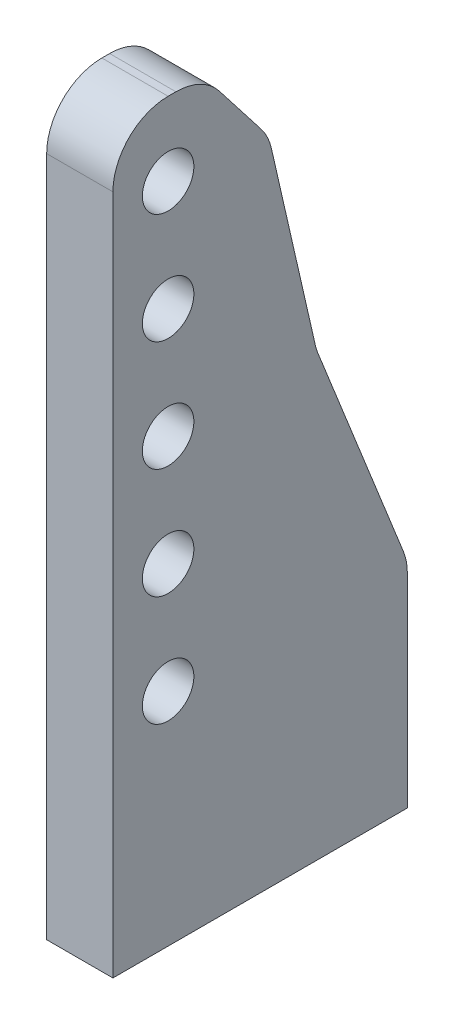
ISO-10303-21;
HEADER;
FILE_DESCRIPTION(('STEP AP214'),'2;1');
FILE_NAME('part.step','',(''),(''),'','','');
FILE_SCHEMA(('AUTOMOTIVE_DESIGN { 1 0 10303 214 1 1 1 1 }'));
ENDSEC;
DATA;
#1=APPLICATION_CONTEXT('core data for automotive mechanical design processes');
#2=APPLICATION_PROTOCOL_DEFINITION('international standard','automotive_design',2000,#1);
#3=PRODUCT_CONTEXT('',#1,'mechanical');
#4=PRODUCT('Part','Part','',(#3));
#5=PRODUCT_RELATED_PRODUCT_CATEGORY('part','',(#4));
#6=PRODUCT_DEFINITION_FORMATION('','',#4);
#7=PRODUCT_DEFINITION_CONTEXT('part definition',#1,'design');
#8=PRODUCT_DEFINITION('design','',#6,#7);
#9=PRODUCT_DEFINITION_SHAPE('','',#8);
#10=(LENGTH_UNIT() NAMED_UNIT(*) SI_UNIT(.MILLI.,.METRE.));
#11=(NAMED_UNIT(*) PLANE_ANGLE_UNIT() SI_UNIT($,.RADIAN.));
#12=(NAMED_UNIT(*) SI_UNIT($,.STERADIAN.) SOLID_ANGLE_UNIT());
#13=UNCERTAINTY_MEASURE_WITH_UNIT(LENGTH_MEASURE(1.E-05),#10,'distance_accuracy_value','');
#14=(GEOMETRIC_REPRESENTATION_CONTEXT(3) GLOBAL_UNCERTAINTY_ASSIGNED_CONTEXT((#13)) GLOBAL_UNIT_ASSIGNED_CONTEXT((#10,
#11,#12)) REPRESENTATION_CONTEXT('',''));
#15=CARTESIAN_POINT('',(0.,0.,0.));
#16=DIRECTION('',(0.,0.,1.));
#17=DIRECTION('',(1.,0.,0.));
#18=AXIS2_PLACEMENT_3D('',#15,#16,#17);
#19=CARTESIAN_POINT('',(-0.9,20.,4.));
#20=DIRECTION('',(1.,0.,0.));
#21=DIRECTION('',(0.,0.,-1.));
#22=AXIS2_PLACEMENT_3D('',#19,#20,#21);
#23=PLANE('',#22);
#24=CARTESIAN_POINT('',(-0.900000000000001,9.,2.49999999999991));
#25=DIRECTION('',(1.,0.,0.));
#26=DIRECTION('',(0.,0.,-1.));
#27=AXIS2_PLACEMENT_3D('',#24,#25,#26);
#28=CIRCLE('',#27,0.7);
#29=CARTESIAN_POINT('',(-0.900000000000001,9.,1.79999999999991));
#30=VERTEX_POINT('',#29);
#31=EDGE_CURVE('E158',#30,#30,#28,.T.);
#32=ORIENTED_EDGE('',*,*,#31,.T.);
#33=EDGE_LOOP('',(#32));
#34=FACE_BOUND('',#33,.T.);
#35=CARTESIAN_POINT('',(-0.900000000000001,12.,2.49999999999994));
#36=DIRECTION('',(1.,0.,0.));
#37=DIRECTION('',(0.,0.,-1.));
#38=AXIS2_PLACEMENT_3D('',#35,#36,#37);
#39=CIRCLE('',#38,0.7);
#40=CARTESIAN_POINT('',(-0.900000000000001,12.,1.79999999999994));
#41=VERTEX_POINT('',#40);
#42=EDGE_CURVE('E162',#41,#41,#39,.T.);
#43=ORIENTED_EDGE('',*,*,#42,.T.);
#44=EDGE_LOOP('',(#43));
#45=FACE_BOUND('',#44,.T.);
#46=CARTESIAN_POINT('',(-0.900000000000001,15.,2.49999999999997));
#47=DIRECTION('',(1.,0.,0.));
#48=DIRECTION('',(0.,0.,-1.));
#49=AXIS2_PLACEMENT_3D('',#46,#47,#48);
#50=CIRCLE('',#49,0.7);
#51=CARTESIAN_POINT('',(-0.900000000000001,15.,1.79999999999997));
#52=VERTEX_POINT('',#51);
#53=EDGE_CURVE('E283',#52,#52,#50,.T.);
#54=ORIENTED_EDGE('',*,*,#53,.T.);
#55=EDGE_LOOP('',(#54));
#56=FACE_BOUND('',#55,.T.);
#57=CARTESIAN_POINT('',(-0.900000000000001,6.,2.49999999999988));
#58=DIRECTION('',(1.,0.,0.));
#59=DIRECTION('',(0.,0.,-1.));
#60=AXIS2_PLACEMENT_3D('',#57,#58,#59);
#61=CIRCLE('',#60,0.7);
#62=CARTESIAN_POINT('',(-0.900000000000001,6.,1.79999999999988));
#63=VERTEX_POINT('',#62);
#64=EDGE_CURVE('E272',#63,#63,#61,.T.);
#65=ORIENTED_EDGE('',*,*,#64,.T.);
#66=EDGE_LOOP('',(#65));
#67=FACE_BOUND('',#66,.T.);
#68=CARTESIAN_POINT('',(-0.900000000000001,18.,2.5));
#69=DIRECTION('',(1.,0.,0.));
#70=DIRECTION('',(0.,0.,-1.));
#71=AXIS2_PLACEMENT_3D('',#68,#69,#70);
#72=CIRCLE('',#71,0.7);
#73=CARTESIAN_POINT('',(-0.900000000000001,18.,1.8));
#74=VERTEX_POINT('',#73);
#75=EDGE_CURVE('E266',#74,#74,#72,.T.);
#76=ORIENTED_EDGE('',*,*,#75,.T.);
#77=EDGE_LOOP('',(#76));
#78=FACE_BOUND('',#77,.T.);
#79=DIRECTION('',(0.,-0.928942568336847,-0.370223857593947));
#80=VECTOR('',#79,1.);
#81=CARTESIAN_POINT('',(-0.9,20.8080641901137,1.97245582976849));
#82=LINE('',#81,#80);
#83=CARTESIAN_POINT('',(-0.9,11.9242457550683,-1.5681306857954));
#84=VERTEX_POINT('',#83);
#85=CARTESIAN_POINT('',(-0.9,6.08979053915674,-3.89341385250527));
#86=VERTEX_POINT('',#85);
#87=EDGE_CURVE('E259',#84,#86,#82,.T.);
#88=ORIENTED_EDGE('',*,*,#87,.T.);
#89=CARTESIAN_POINT('',(-0.9,5.53445475276582,-2.5));
#90=DIRECTION('',(1.,0.,0.));
#91=DIRECTION('',(0.,0.,-1.));
#92=AXIS2_PLACEMENT_3D('',#89,#90,#91);
#93=CIRCLE('',#92,1.5);
#94=CARTESIAN_POINT('',(-0.9,5.53445475276582,-4.));
#95=VERTEX_POINT('',#94);
#96=EDGE_CURVE('E211',#86,#95,#93,.F.);
#97=ORIENTED_EDGE('',*,*,#96,.T.);
#98=DIRECTION('',(0.,-1.,0.));
#99=VECTOR('',#98,1.);
#100=CARTESIAN_POINT('',(-0.9,20.,-4.));
#101=LINE('',#100,#99);
#102=CARTESIAN_POINT('',(-0.9,0.,-4.));
#103=VERTEX_POINT('',#102);
#104=EDGE_CURVE('E155',#95,#103,#101,.T.);
#105=ORIENTED_EDGE('',*,*,#104,.T.);
#106=DIRECTION('',(0.,0.,1.));
#107=VECTOR('',#106,1.);
#108=CARTESIAN_POINT('',(-0.9,0.,4.));
#109=LINE('',#108,#107);
#110=CARTESIAN_POINT('',(-0.9,0.,4.));
#111=VERTEX_POINT('',#110);
#112=EDGE_CURVE('E148',#103,#111,#109,.T.);
#113=ORIENTED_EDGE('',*,*,#112,.T.);
#114=DIRECTION('',(0.,-1.,0.));
#115=VECTOR('',#114,1.);
#116=CARTESIAN_POINT('',(-0.9,20.,4.));
#117=LINE('',#116,#115);
#118=CARTESIAN_POINT('',(-0.9,18.5,4.));
#119=VERTEX_POINT('',#118);
#120=EDGE_CURVE('E130',#119,#111,#117,.T.);
#121=ORIENTED_EDGE('',*,*,#120,.F.);
#122=CARTESIAN_POINT('',(-0.9,18.5,2.5));
#123=DIRECTION('',(1.,0.,0.));
#124=DIRECTION('',(0.,0.,-1.));
#125=AXIS2_PLACEMENT_3D('',#122,#123,#124);
#126=CIRCLE('',#125,1.5);
#127=CARTESIAN_POINT('',(-0.9,20.,2.5));
#128=VERTEX_POINT('',#127);
#129=EDGE_CURVE('E203',#119,#128,#126,.F.);
#130=ORIENTED_EDGE('',*,*,#129,.T.);
#131=DIRECTION('',(0.,0.,1.));
#132=VECTOR('',#131,1.);
#133=CARTESIAN_POINT('',(-0.9,20.,4.));
#134=LINE('',#133,#132);
#135=CARTESIAN_POINT('',(-0.9,20.,2.28881476128882));
#136=VERTEX_POINT('',#135);
#137=EDGE_CURVE('E173',#136,#128,#134,.T.);
#138=ORIENTED_EDGE('',*,*,#137,.F.);
#139=CARTESIAN_POINT('',(-0.900000000000001,18.5,2.28881476128882));
#140=DIRECTION('',(1.,0.,0.));
#141=DIRECTION('',(0.,0.,-1.));
#142=AXIS2_PLACEMENT_3D('',#139,#140,#141);
#143=CIRCLE('',#142,1.5);
#144=CARTESIAN_POINT('',(-0.9,19.4197972471383,1.10392108497991));
#145=VERTEX_POINT('',#144);
#146=EDGE_CURVE('E62',#136,#145,#143,.F.);
#147=ORIENTED_EDGE('',*,*,#146,.T.);
#148=DIRECTION('',(0.,-0.789929117539271,-0.613198164758855));
#149=VECTOR('',#148,1.);
#150=CARTESIAN_POINT('',(-0.9,21.184648448458,2.47392187833326));
#151=LINE('',#150,#149);
#152=CARTESIAN_POINT('',(-0.9,17.9629217286741,-0.0270074684417779));
#153=VERTEX_POINT('',#152);
#154=EDGE_CURVE('E267',#145,#153,#151,.T.);
#155=ORIENTED_EDGE('',*,*,#154,.T.);
#156=CARTESIAN_POINT('',(-0.900000000000001,17.0431244815358,1.15788620786713));
#157=DIRECTION('',(1.,0.,0.));
#158=DIRECTION('',(0.,0.,-1.));
#159=AXIS2_PLACEMENT_3D('',#156,#157,#158);
#160=CIRCLE('',#159,1.5);
#161=CARTESIAN_POINT('',(-0.9,17.3770868892502,-0.304464335003363));
#162=VERTEX_POINT('',#161);
#163=EDGE_CURVE('E208',#153,#162,#160,.F.);
#164=ORIENTED_EDGE('',*,*,#163,.T.);
#165=DIRECTION('',(0.,-0.974900361913661,-0.222641605142912));
#166=VECTOR('',#165,1.);
#167=CARTESIAN_POINT('',(-0.9,20.8042826133736,0.478217041440041));
#168=LINE('',#167,#166);
#169=CARTESIAN_POINT('',(-0.9,12.1456191337448,-1.49919399543018));
#170=VERTEX_POINT('',#169);
#171=EDGE_CURVE('E261',#162,#170,#168,.T.);
#172=ORIENTED_EDGE('',*,*,#171,.T.);
#173=CARTESIAN_POINT('',(-0.900000000000001,12.4795815414592,-2.96154453830067));
#174=DIRECTION('',(1.,0.,0.));
#175=DIRECTION('',(0.,0.,-1.));
#176=AXIS2_PLACEMENT_3D('',#173,#174,#175);
#177=CIRCLE('',#176,1.5);
#178=EDGE_CURVE('E11',#170,#84,#177,.T.);
#179=ORIENTED_EDGE('',*,*,#178,.T.);
#180=EDGE_LOOP('',(#88,#97,#105,#113,#121,#130,#138,#147,#155,#164,#172,#179));
#181=FACE_BOUND('',#180,.T.);
#182=ADVANCED_FACE('F39',(#34,#45,#56,#67,#78,#181),#23,.F.);
#183=CARTESIAN_POINT('',(0.9,20.,4.));
#184=DIRECTION('',(0.,0.,-1.));
#185=DIRECTION('',(-1.,0.,0.));
#186=AXIS2_PLACEMENT_3D('',#183,#184,#185);
#187=PLANE('',#186);
#188=DIRECTION('',(0.,-1.,0.));
#189=VECTOR('',#188,1.);
#190=CARTESIAN_POINT('',(0.9,20.,4.));
#191=LINE('',#190,#189);
#192=CARTESIAN_POINT('',(0.9,18.5,4.));
#193=VERTEX_POINT('',#192);
#194=CARTESIAN_POINT('',(0.9,0.,4.));
#195=VERTEX_POINT('',#194);
#196=EDGE_CURVE('E142',#193,#195,#191,.T.);
#197=ORIENTED_EDGE('',*,*,#196,.F.);
#198=DIRECTION('',(1.,0.,0.));
#199=VECTOR('',#198,1.);
#200=CARTESIAN_POINT('',(-0.9,18.5,4.));
#201=LINE('',#200,#199);
#202=EDGE_CURVE('E137',#193,#119,#201,.F.);
#203=ORIENTED_EDGE('',*,*,#202,.T.);
#204=ORIENTED_EDGE('',*,*,#120,.T.);
#205=DIRECTION('',(1.,0.,0.));
#206=VECTOR('',#205,1.);
#207=CARTESIAN_POINT('',(0.9,0.,4.));
#208=LINE('',#207,#206);
#209=EDGE_CURVE('E134',#111,#195,#208,.T.);
#210=ORIENTED_EDGE('',*,*,#209,.T.);
#211=EDGE_LOOP('',(#197,#203,#204,#210));
#212=FACE_BOUND('',#211,.T.);
#213=ADVANCED_FACE('F133',(#212),#187,.F.);
#214=CARTESIAN_POINT('',(0.9,20.,4.));
#215=DIRECTION('',(-1.,0.,0.));
#216=DIRECTION('',(0.,0.,1.));
#217=AXIS2_PLACEMENT_3D('',#214,#215,#216);
#218=PLANE('',#217);
#219=CARTESIAN_POINT('',(0.9,9.,2.49999999999991));
#220=DIRECTION('',(1.,0.,0.));
#221=DIRECTION('',(0.,0.,-1.));
#222=AXIS2_PLACEMENT_3D('',#219,#220,#221);
#223=CIRCLE('',#222,0.7);
#224=CARTESIAN_POINT('',(0.9,9.,1.79999999999991));
#225=VERTEX_POINT('',#224);
#226=EDGE_CURVE('E311',#225,#225,#223,.T.);
#227=ORIENTED_EDGE('',*,*,#226,.F.);
#228=EDGE_LOOP('',(#227));
#229=FACE_BOUND('',#228,.T.);
#230=CARTESIAN_POINT('',(0.9,12.,2.49999999999994));
#231=DIRECTION('',(1.,0.,0.));
#232=DIRECTION('',(0.,0.,-1.));
#233=AXIS2_PLACEMENT_3D('',#230,#231,#232);
#234=CIRCLE('',#233,0.7);
#235=CARTESIAN_POINT('',(0.9,12.,1.79999999999994));
#236=VERTEX_POINT('',#235);
#237=EDGE_CURVE('E308',#236,#236,#234,.T.);
#238=ORIENTED_EDGE('',*,*,#237,.F.);
#239=EDGE_LOOP('',(#238));
#240=FACE_BOUND('',#239,.T.);
#241=CARTESIAN_POINT('',(0.9,15.,2.49999999999997));
#242=DIRECTION('',(1.,0.,0.));
#243=DIRECTION('',(0.,0.,-1.));
#244=AXIS2_PLACEMENT_3D('',#241,#242,#243);
#245=CIRCLE('',#244,0.7);
#246=CARTESIAN_POINT('',(0.9,15.,1.79999999999997));
#247=VERTEX_POINT('',#246);
#248=EDGE_CURVE('E304',#247,#247,#245,.T.);
#249=ORIENTED_EDGE('',*,*,#248,.F.);
#250=EDGE_LOOP('',(#249));
#251=FACE_BOUND('',#250,.T.);
#252=CARTESIAN_POINT('',(0.9,6.,2.49999999999988));
#253=DIRECTION('',(1.,0.,0.));
#254=DIRECTION('',(0.,0.,-1.));
#255=AXIS2_PLACEMENT_3D('',#252,#253,#254);
#256=CIRCLE('',#255,0.7);
#257=CARTESIAN_POINT('',(0.9,6.,1.79999999999988));
#258=VERTEX_POINT('',#257);
#259=EDGE_CURVE('E496',#258,#258,#256,.T.);
#260=ORIENTED_EDGE('',*,*,#259,.F.);
#261=EDGE_LOOP('',(#260));
#262=FACE_BOUND('',#261,.T.);
#263=CARTESIAN_POINT('',(0.9,18.,2.5));
#264=DIRECTION('',(1.,0.,0.));
#265=DIRECTION('',(0.,0.,-1.));
#266=AXIS2_PLACEMENT_3D('',#263,#264,#265);
#267=CIRCLE('',#266,0.7);
#268=CARTESIAN_POINT('',(0.9,18.,1.8));
#269=VERTEX_POINT('',#268);
#270=EDGE_CURVE('E274',#269,#269,#267,.T.);
#271=ORIENTED_EDGE('',*,*,#270,.F.);
#272=EDGE_LOOP('',(#271));
#273=FACE_BOUND('',#272,.T.);
#274=DIRECTION('',(0.,-1.,0.));
#275=VECTOR('',#274,1.);
#276=CARTESIAN_POINT('',(0.9,20.,-4.));
#277=LINE('',#276,#275);
#278=CARTESIAN_POINT('',(0.9,5.53445475276582,-4.));
#279=VERTEX_POINT('',#278);
#280=CARTESIAN_POINT('',(0.9,0.,-4.));
#281=VERTEX_POINT('',#280);
#282=EDGE_CURVE('E176',#279,#281,#277,.T.);
#283=ORIENTED_EDGE('',*,*,#282,.F.);
#284=CARTESIAN_POINT('',(0.9,5.53445475276582,-2.5));
#285=DIRECTION('',(-1.,0.,0.));
#286=DIRECTION('',(0.,0.,1.));
#287=AXIS2_PLACEMENT_3D('',#284,#285,#286);
#288=CIRCLE('',#287,1.5);
#289=CARTESIAN_POINT('',(0.9,6.08979053915674,-3.89341385250527));
#290=VERTEX_POINT('',#289);
#291=EDGE_CURVE('E193',#279,#290,#288,.F.);
#292=ORIENTED_EDGE('',*,*,#291,.T.);
#293=DIRECTION('',(0.,-0.928942568336847,-0.370223857593947));
#294=VECTOR('',#293,1.);
#295=CARTESIAN_POINT('',(0.9,12.0322605243971,-1.52508212074836));
#296=LINE('',#295,#294);
#297=CARTESIAN_POINT('',(0.9,11.9242457550683,-1.5681306857954));
#298=VERTEX_POINT('',#297);
#299=EDGE_CURVE('E244',#298,#290,#296,.T.);
#300=ORIENTED_EDGE('',*,*,#299,.F.);
#301=CARTESIAN_POINT('',(0.900000000000001,12.4795815414592,-2.96154453830067));
#302=DIRECTION('',(-1.,0.,0.));
#303=DIRECTION('',(0.,0.,1.));
#304=AXIS2_PLACEMENT_3D('',#301,#302,#303);
#305=CIRCLE('',#304,1.5);
#306=CARTESIAN_POINT('',(0.9,12.1456191337448,-1.49919399543018));
#307=VERTEX_POINT('',#306);
#308=EDGE_CURVE('E48',#298,#307,#305,.T.);
#309=ORIENTED_EDGE('',*,*,#308,.T.);
#310=DIRECTION('',(0.,-0.974900361913661,-0.222641605142912));
#311=VECTOR('',#310,1.);
#312=CARTESIAN_POINT('',(0.9,17.7007048951966,-0.230558492814909));
#313=LINE('',#312,#311);
#314=CARTESIAN_POINT('',(0.9,17.3770868892502,-0.304464335003363));
#315=VERTEX_POINT('',#314);
#316=EDGE_CURVE('E242',#315,#307,#313,.T.);
#317=ORIENTED_EDGE('',*,*,#316,.F.);
#318=CARTESIAN_POINT('',(0.900000000000001,17.0431244815358,1.15788620786713));
#319=DIRECTION('',(-1.,0.,0.));
#320=DIRECTION('',(0.,0.,1.));
#321=AXIS2_PLACEMENT_3D('',#318,#319,#320);
#322=CIRCLE('',#321,1.5);
#323=CARTESIAN_POINT('',(0.9,17.9629217286741,-0.0270074684417777));
#324=VERTEX_POINT('',#323);
#325=EDGE_CURVE('E190',#315,#324,#322,.F.);
#326=ORIENTED_EDGE('',*,*,#325,.T.);
#327=DIRECTION('',(0.,-0.789929117539271,-0.613198164758855));
#328=VECTOR('',#327,1.);
#329=CARTESIAN_POINT('',(0.9,20.,1.55431499418425));
#330=LINE('',#329,#328);
#331=CARTESIAN_POINT('',(0.9,19.4197972471383,1.10392108497991));
#332=VERTEX_POINT('',#331);
#333=EDGE_CURVE('E254',#332,#324,#330,.T.);
#334=ORIENTED_EDGE('',*,*,#333,.F.);
#335=CARTESIAN_POINT('',(0.900000000000001,18.5,2.28881476128882));
#336=DIRECTION('',(-1.,0.,0.));
#337=DIRECTION('',(0.,0.,1.));
#338=AXIS2_PLACEMENT_3D('',#335,#336,#337);
#339=CIRCLE('',#338,1.5);
#340=CARTESIAN_POINT('',(0.9,20.,2.28881476128882));
#341=VERTEX_POINT('',#340);
#342=EDGE_CURVE('E187',#332,#341,#339,.F.);
#343=ORIENTED_EDGE('',*,*,#342,.T.);
#344=DIRECTION('',(0.,0.,-1.));
#345=VECTOR('',#344,1.);
#346=CARTESIAN_POINT('',(0.9,20.,4.));
#347=LINE('',#346,#345);
#348=CARTESIAN_POINT('',(0.9,20.,2.5));
#349=VERTEX_POINT('',#348);
#350=EDGE_CURVE('E165',#349,#341,#347,.T.);
#351=ORIENTED_EDGE('',*,*,#350,.F.);
#352=CARTESIAN_POINT('',(0.9,18.5,2.5));
#353=DIRECTION('',(-1.,0.,0.));
#354=DIRECTION('',(0.,0.,1.));
#355=AXIS2_PLACEMENT_3D('',#352,#353,#354);
#356=CIRCLE('',#355,1.5);
#357=EDGE_CURVE('E184',#349,#193,#356,.F.);
#358=ORIENTED_EDGE('',*,*,#357,.T.);
#359=ORIENTED_EDGE('',*,*,#196,.T.);
#360=DIRECTION('',(0.,0.,-1.));
#361=VECTOR('',#360,1.);
#362=CARTESIAN_POINT('',(0.9,0.,4.));
#363=LINE('',#362,#361);
#364=EDGE_CURVE('E150',#195,#281,#363,.T.);
#365=ORIENTED_EDGE('',*,*,#364,.T.);
#366=EDGE_LOOP('',(#283,#292,#300,#309,#317,#326,#334,#343,#351,#358,#359,#365));
#367=FACE_BOUND('',#366,.T.);
#368=ADVANCED_FACE('F241',(#229,#240,#251,#262,#273,#367),#218,.F.);
#369=CARTESIAN_POINT('',(0.9,20.,-4.));
#370=DIRECTION('',(0.,0.,1.));
#371=DIRECTION('',(1.,0.,0.));
#372=AXIS2_PLACEMENT_3D('',#369,#370,#371);
#373=PLANE('',#372);
#374=ORIENTED_EDGE('',*,*,#104,.F.);
#375=DIRECTION('',(1.,0.,0.));
#376=VECTOR('',#375,1.);
#377=CARTESIAN_POINT('',(0.9,5.53445475276582,-4.));
#378=LINE('',#377,#376);
#379=EDGE_CURVE('E141',#95,#279,#378,.T.);
#380=ORIENTED_EDGE('',*,*,#379,.T.);
#381=ORIENTED_EDGE('',*,*,#282,.T.);
#382=DIRECTION('',(-1.,0.,0.));
#383=VECTOR('',#382,1.);
#384=CARTESIAN_POINT('',(0.9,0.,-4.));
#385=LINE('',#384,#383);
#386=EDGE_CURVE('E170',#281,#103,#385,.T.);
#387=ORIENTED_EDGE('',*,*,#386,.T.);
#388=EDGE_LOOP('',(#374,#380,#381,#387));
#389=FACE_BOUND('',#388,.T.);
#390=ADVANCED_FACE('F323',(#389),#373,.F.);
#391=CARTESIAN_POINT('',(0.,20.,0.));
#392=DIRECTION('',(0.,1.,0.));
#393=DIRECTION('',(0.,0.,1.));
#394=AXIS2_PLACEMENT_3D('',#391,#392,#393);
#395=PLANE('',#394);
#396=ORIENTED_EDGE('',*,*,#350,.T.);
#397=DIRECTION('',(1.,0.,0.));
#398=VECTOR('',#397,1.);
#399=CARTESIAN_POINT('',(-0.900000000000008,20.,2.28881476128882));
#400=LINE('',#399,#398);
#401=EDGE_CURVE('E231',#341,#136,#400,.F.);
#402=ORIENTED_EDGE('',*,*,#401,.T.);
#403=ORIENTED_EDGE('',*,*,#137,.T.);
#404=DIRECTION('',(1.,0.,0.));
#405=VECTOR('',#404,1.);
#406=CARTESIAN_POINT('',(0.9,20.,2.5));
#407=LINE('',#406,#405);
#408=EDGE_CURVE('E227',#128,#349,#407,.T.);
#409=ORIENTED_EDGE('',*,*,#408,.T.);
#410=EDGE_LOOP('',(#396,#402,#403,#409));
#411=FACE_BOUND('',#410,.T.);
#412=ADVANCED_FACE('F297',(#411),#395,.T.);
#413=CARTESIAN_POINT('',(0.,0.,0.));
#414=DIRECTION('',(0.,1.,0.));
#415=DIRECTION('',(0.,0.,1.));
#416=AXIS2_PLACEMENT_3D('',#413,#414,#415);
#417=PLANE('',#416);
#418=ORIENTED_EDGE('',*,*,#112,.F.);
#419=ORIENTED_EDGE('',*,*,#386,.F.);
#420=ORIENTED_EDGE('',*,*,#364,.F.);
#421=ORIENTED_EDGE('',*,*,#209,.F.);
#422=EDGE_LOOP('',(#418,#419,#420,#421));
#423=FACE_BOUND('',#422,.T.);
#424=ADVANCED_FACE('F146',(#423),#417,.F.);
#425=CARTESIAN_POINT('',(-19.1,17.7007048951966,-0.230558492814909));
#426=DIRECTION('',(0.,-0.222641605142912,0.974900361913661));
#427=DIRECTION('',(0.,-0.974900361913661,-0.222641605142912));
#428=AXIS2_PLACEMENT_3D('',#425,#426,#427);
#429=PLANE('',#428);
#430=ORIENTED_EDGE('',*,*,#316,.T.);
#431=DIRECTION('',(1.,0.,0.));
#432=VECTOR('',#431,1.);
#433=CARTESIAN_POINT('',(-0.900000000000001,12.1456191337448,-1.49919399543018));
#434=LINE('',#433,#432);
#435=EDGE_CURVE('E218',#307,#170,#434,.F.);
#436=ORIENTED_EDGE('',*,*,#435,.T.);
#437=ORIENTED_EDGE('',*,*,#171,.F.);
#438=DIRECTION('',(1.,0.,0.));
#439=VECTOR('',#438,1.);
#440=CARTESIAN_POINT('',(-19.1,17.3770868892502,-0.304464335003363));
#441=LINE('',#440,#439);
#442=EDGE_CURVE('E214',#162,#315,#441,.T.);
#443=ORIENTED_EDGE('',*,*,#442,.T.);
#444=EDGE_LOOP('',(#430,#436,#437,#443));
#445=FACE_BOUND('',#444,.T.);
#446=ADVANCED_FACE('F249',(#445),#429,.F.);
#447=CARTESIAN_POINT('',(-19.1,12.0322605243971,-1.52508212074836));
#448=DIRECTION('',(0.,-0.370223857593947,0.928942568336847));
#449=DIRECTION('',(0.,-0.928942568336847,-0.370223857593947));
#450=AXIS2_PLACEMENT_3D('',#447,#448,#449);
#451=PLANE('',#450);
#452=ORIENTED_EDGE('',*,*,#299,.T.);
#453=DIRECTION('',(1.,0.,0.));
#454=VECTOR('',#453,1.);
#455=CARTESIAN_POINT('',(-19.1,6.08979053915674,-3.89341385250527));
#456=LINE('',#455,#454);
#457=EDGE_CURVE('E200',#290,#86,#456,.F.);
#458=ORIENTED_EDGE('',*,*,#457,.T.);
#459=ORIENTED_EDGE('',*,*,#87,.F.);
#460=DIRECTION('',(1.,0.,0.));
#461=VECTOR('',#460,1.);
#462=CARTESIAN_POINT('',(0.900000000000001,11.9242457550683,-1.5681306857954));
#463=LINE('',#462,#461);
#464=EDGE_CURVE('E196',#84,#298,#463,.T.);
#465=ORIENTED_EDGE('',*,*,#464,.T.);
#466=EDGE_LOOP('',(#452,#458,#459,#465));
#467=FACE_BOUND('',#466,.T.);
#468=ADVANCED_FACE('F263',(#467),#451,.F.);
#469=CARTESIAN_POINT('',(-19.1,20.,1.55431499418425));
#470=DIRECTION('',(0.,-0.613198164758855,0.789929117539271));
#471=DIRECTION('',(0.,-0.789929117539271,-0.613198164758855));
#472=AXIS2_PLACEMENT_3D('',#469,#470,#471);
#473=PLANE('',#472);
#474=ORIENTED_EDGE('',*,*,#333,.T.);
#475=DIRECTION('',(1.,0.,0.));
#476=VECTOR('',#475,1.);
#477=CARTESIAN_POINT('',(-19.1,17.9629217286741,-0.0270074684417777));
#478=LINE('',#477,#476);
#479=EDGE_CURVE('E55',#324,#153,#478,.F.);
#480=ORIENTED_EDGE('',*,*,#479,.T.);
#481=ORIENTED_EDGE('',*,*,#154,.F.);
#482=DIRECTION('',(1.,0.,0.));
#483=VECTOR('',#482,1.);
#484=CARTESIAN_POINT('',(0.899999999999995,19.4197972471383,1.10392108497991));
#485=LINE('',#484,#483);
#486=EDGE_CURVE('E221',#145,#332,#485,.T.);
#487=ORIENTED_EDGE('',*,*,#486,.T.);
#488=EDGE_LOOP('',(#474,#480,#481,#487));
#489=FACE_BOUND('',#488,.T.);
#490=ADVANCED_FACE('F302',(#489),#473,.F.);
#491=CARTESIAN_POINT('',(-19.1,18.,2.5));
#492=DIRECTION('',(1.,0.,0.));
#493=DIRECTION('',(0.,0.,-1.));
#494=AXIS2_PLACEMENT_3D('',#491,#492,#493);
#495=CYLINDRICAL_SURFACE('',#494,0.7);
#496=ORIENTED_EDGE('',*,*,#270,.T.);
#497=EDGE_LOOP('',(#496));
#498=FACE_BOUND('',#497,.T.);
#499=ORIENTED_EDGE('',*,*,#75,.F.);
#500=EDGE_LOOP('',(#499));
#501=FACE_BOUND('',#500,.T.);
#502=ADVANCED_FACE('F319',(#498,#501),#495,.F.);
#503=CARTESIAN_POINT('',(-19.1,6.,2.49999999999988));
#504=DIRECTION('',(1.,0.,0.));
#505=DIRECTION('',(0.,0.,-1.));
#506=AXIS2_PLACEMENT_3D('',#503,#504,#505);
#507=CYLINDRICAL_SURFACE('',#506,0.7);
#508=ORIENTED_EDGE('',*,*,#259,.T.);
#509=EDGE_LOOP('',(#508));
#510=FACE_BOUND('',#509,.T.);
#511=ORIENTED_EDGE('',*,*,#64,.F.);
#512=EDGE_LOOP('',(#511));
#513=FACE_BOUND('',#512,.T.);
#514=ADVANCED_FACE('F467',(#510,#513),#507,.F.);
#515=CARTESIAN_POINT('',(-19.1,15.,2.49999999999997));
#516=DIRECTION('',(1.,0.,0.));
#517=DIRECTION('',(0.,0.,-1.));
#518=AXIS2_PLACEMENT_3D('',#515,#516,#517);
#519=CYLINDRICAL_SURFACE('',#518,0.7);
#520=ORIENTED_EDGE('',*,*,#248,.T.);
#521=EDGE_LOOP('',(#520));
#522=FACE_BOUND('',#521,.T.);
#523=ORIENTED_EDGE('',*,*,#53,.F.);
#524=EDGE_LOOP('',(#523));
#525=FACE_BOUND('',#524,.T.);
#526=ADVANCED_FACE('F457',(#522,#525),#519,.F.);
#527=CARTESIAN_POINT('',(-19.1,12.,2.49999999999994));
#528=DIRECTION('',(1.,0.,0.));
#529=DIRECTION('',(0.,0.,-1.));
#530=AXIS2_PLACEMENT_3D('',#527,#528,#529);
#531=CYLINDRICAL_SURFACE('',#530,0.7);
#532=ORIENTED_EDGE('',*,*,#237,.T.);
#533=EDGE_LOOP('',(#532));
#534=FACE_BOUND('',#533,.T.);
#535=ORIENTED_EDGE('',*,*,#42,.F.);
#536=EDGE_LOOP('',(#535));
#537=FACE_BOUND('',#536,.T.);
#538=ADVANCED_FACE('F447',(#534,#537),#531,.F.);
#539=CARTESIAN_POINT('',(-19.1,9.,2.49999999999991));
#540=DIRECTION('',(1.,0.,0.));
#541=DIRECTION('',(0.,0.,-1.));
#542=AXIS2_PLACEMENT_3D('',#539,#540,#541);
#543=CYLINDRICAL_SURFACE('',#542,0.7);
#544=ORIENTED_EDGE('',*,*,#226,.T.);
#545=EDGE_LOOP('',(#544));
#546=FACE_BOUND('',#545,.T.);
#547=ORIENTED_EDGE('',*,*,#31,.F.);
#548=EDGE_LOOP('',(#547));
#549=FACE_BOUND('',#548,.T.);
#550=ADVANCED_FACE('F345',(#546,#549),#543,.F.);
#551=CARTESIAN_POINT('',(0.9,5.53445475276582,-2.5));
#552=DIRECTION('',(1.,0.,0.));
#553=DIRECTION('',(0.,0.,-1.));
#554=AXIS2_PLACEMENT_3D('',#551,#552,#553);
#555=CYLINDRICAL_SURFACE('',#554,1.5);
#556=ORIENTED_EDGE('',*,*,#96,.F.);
#557=ORIENTED_EDGE('',*,*,#457,.F.);
#558=ORIENTED_EDGE('',*,*,#291,.F.);
#559=ORIENTED_EDGE('',*,*,#379,.F.);
#560=EDGE_LOOP('',(#556,#557,#558,#559));
#561=FACE_BOUND('',#560,.T.);
#562=ADVANCED_FACE('F342',(#561),#555,.T.);
#563=CARTESIAN_POINT('',(-19.1,12.4795815414592,-2.96154453830067));
#564=DIRECTION('',(-1.,0.,0.));
#565=DIRECTION('',(0.,0.,1.));
#566=AXIS2_PLACEMENT_3D('',#563,#564,#565);
#567=CYLINDRICAL_SURFACE('',#566,1.5);
#568=ORIENTED_EDGE('',*,*,#178,.F.);
#569=ORIENTED_EDGE('',*,*,#435,.F.);
#570=ORIENTED_EDGE('',*,*,#308,.F.);
#571=ORIENTED_EDGE('',*,*,#464,.F.);
#572=EDGE_LOOP('',(#568,#569,#570,#571));
#573=FACE_BOUND('',#572,.T.);
#574=ADVANCED_FACE('F257',(#573),#567,.F.);
#575=CARTESIAN_POINT('',(-19.1,17.0431244815358,1.15788620786713));
#576=DIRECTION('',(1.,0.,0.));
#577=DIRECTION('',(0.,0.,-1.));
#578=AXIS2_PLACEMENT_3D('',#575,#576,#577);
#579=CYLINDRICAL_SURFACE('',#578,1.5);
#580=ORIENTED_EDGE('',*,*,#163,.F.);
#581=ORIENTED_EDGE('',*,*,#479,.F.);
#582=ORIENTED_EDGE('',*,*,#325,.F.);
#583=ORIENTED_EDGE('',*,*,#442,.F.);
#584=EDGE_LOOP('',(#580,#581,#582,#583));
#585=FACE_BOUND('',#584,.T.);
#586=ADVANCED_FACE('F349',(#585),#579,.T.);
#587=CARTESIAN_POINT('',(-19.1,18.5,2.28881476128882));
#588=DIRECTION('',(-1.,0.,0.));
#589=DIRECTION('',(0.,0.,1.));
#590=AXIS2_PLACEMENT_3D('',#587,#588,#589);
#591=CYLINDRICAL_SURFACE('',#590,1.5);
#592=ORIENTED_EDGE('',*,*,#146,.F.);
#593=ORIENTED_EDGE('',*,*,#401,.F.);
#594=ORIENTED_EDGE('',*,*,#342,.F.);
#595=ORIENTED_EDGE('',*,*,#486,.F.);
#596=EDGE_LOOP('',(#592,#593,#594,#595));
#597=FACE_BOUND('',#596,.T.);
#598=ADVANCED_FACE('F299',(#597),#591,.T.);
#599=CARTESIAN_POINT('',(0.,18.5,2.5));
#600=DIRECTION('',(-1.,0.,0.));
#601=DIRECTION('',(0.,0.,1.));
#602=AXIS2_PLACEMENT_3D('',#599,#600,#601);
#603=CYLINDRICAL_SURFACE('',#602,1.5);
#604=ORIENTED_EDGE('',*,*,#129,.F.);
#605=ORIENTED_EDGE('',*,*,#202,.F.);
#606=ORIENTED_EDGE('',*,*,#357,.F.);
#607=ORIENTED_EDGE('',*,*,#408,.F.);
#608=EDGE_LOOP('',(#604,#605,#606,#607));
#609=FACE_BOUND('',#608,.T.);
#610=ADVANCED_FACE('F41',(#609),#603,.T.);
#611=CLOSED_SHELL('',(#182,#213,#368,#390,#412,#424,#446,#468,#490,#502,#514,#526,#538,#550,
#562,#574,#586,#598,#610));
#612=MANIFOLD_SOLID_BREP('B2',#611);
#613=ADVANCED_BREP_SHAPE_REPRESENTATION('',(#18,#612),#14);
#614=SHAPE_DEFINITION_REPRESENTATION(#9,#613);
ENDSEC;
END-ISO-10303-21;
